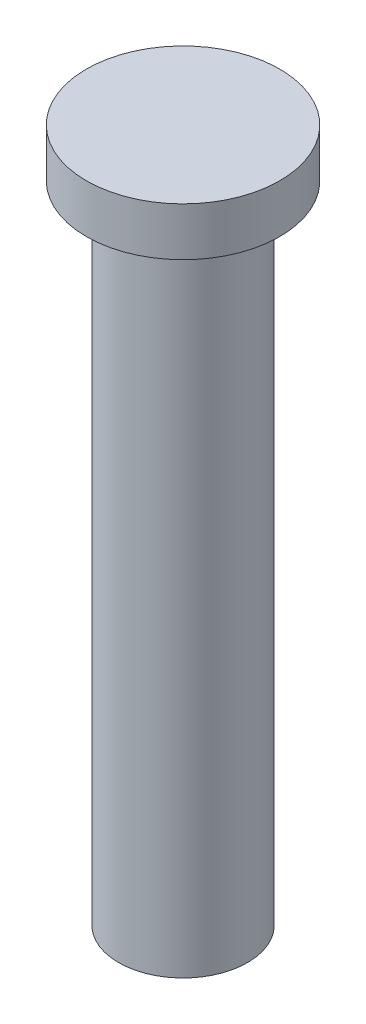
ISO-10303-21;
HEADER;
FILE_DESCRIPTION(('STEP AP214'),'2;1');
FILE_NAME('part.step','',(''),(''),'','','');
FILE_SCHEMA(('AUTOMOTIVE_DESIGN { 1 0 10303 214 1 1 1 1 }'));
ENDSEC;
DATA;
#1=APPLICATION_CONTEXT('core data for automotive mechanical design processes');
#2=APPLICATION_PROTOCOL_DEFINITION('international standard','automotive_design',2000,#1);
#3=PRODUCT_CONTEXT('',#1,'mechanical');
#4=PRODUCT('Part','Part','',(#3));
#5=PRODUCT_RELATED_PRODUCT_CATEGORY('part','',(#4));
#6=PRODUCT_DEFINITION_FORMATION('','',#4);
#7=PRODUCT_DEFINITION_CONTEXT('part definition',#1,'design');
#8=PRODUCT_DEFINITION('design','',#6,#7);
#9=PRODUCT_DEFINITION_SHAPE('','',#8);
#10=(LENGTH_UNIT() NAMED_UNIT(*) SI_UNIT(.MILLI.,.METRE.));
#11=(NAMED_UNIT(*) PLANE_ANGLE_UNIT() SI_UNIT($,.RADIAN.));
#12=(NAMED_UNIT(*) SI_UNIT($,.STERADIAN.) SOLID_ANGLE_UNIT());
#13=UNCERTAINTY_MEASURE_WITH_UNIT(LENGTH_MEASURE(1.E-05),#10,'distance_accuracy_value','');
#14=(GEOMETRIC_REPRESENTATION_CONTEXT(3) GLOBAL_UNCERTAINTY_ASSIGNED_CONTEXT((#13)) GLOBAL_UNIT_ASSIGNED_CONTEXT((#10,
#11,#12)) REPRESENTATION_CONTEXT('',''));
#15=CARTESIAN_POINT('',(0.,0.,0.));
#16=DIRECTION('',(0.,0.,1.));
#17=DIRECTION('',(1.,0.,0.));
#18=AXIS2_PLACEMENT_3D('',#15,#16,#17);
#19=CARTESIAN_POINT('',(0.,20.,0.));
#20=DIRECTION('',(0.,-1.,0.));
#21=DIRECTION('',(0.,0.,-1.));
#22=AXIS2_PLACEMENT_3D('',#19,#20,#21);
#23=CYLINDRICAL_SURFACE('',#22,2.);
#24=CARTESIAN_POINT('',(0.,20.,0.));
#25=DIRECTION('',(0.,1.,0.));
#26=DIRECTION('',(0.,0.,1.));
#27=AXIS2_PLACEMENT_3D('',#24,#25,#26);
#28=CIRCLE('',#27,2.);
#29=CARTESIAN_POINT('',(0.,20.,2.));
#30=VERTEX_POINT('',#29);
#31=EDGE_CURVE('E10',#30,#30,#28,.T.);
#32=ORIENTED_EDGE('',*,*,#31,.F.);
#33=EDGE_LOOP('',(#32));
#34=FACE_BOUND('',#33,.T.);
#35=CARTESIAN_POINT('',(0.,0.,0.));
#36=DIRECTION('',(0.,1.,0.));
#37=DIRECTION('',(0.,0.,1.));
#38=AXIS2_PLACEMENT_3D('',#35,#36,#37);
#39=CIRCLE('',#38,2.);
#40=CARTESIAN_POINT('',(0.,0.,2.));
#41=VERTEX_POINT('',#40);
#42=EDGE_CURVE('E36',#41,#41,#39,.T.);
#43=ORIENTED_EDGE('',*,*,#42,.T.);
#44=EDGE_LOOP('',(#43));
#45=FACE_BOUND('',#44,.T.);
#46=ADVANCED_FACE('F33',(#34,#45),#23,.T.);
#47=CARTESIAN_POINT('',(0.,0.,0.));
#48=DIRECTION('',(0.,1.,0.));
#49=DIRECTION('',(0.,0.,1.));
#50=AXIS2_PLACEMENT_3D('',#47,#48,#49);
#51=PLANE('',#50);
#52=ORIENTED_EDGE('',*,*,#42,.F.);
#53=EDGE_LOOP('',(#52));
#54=FACE_BOUND('',#53,.T.);
#55=ADVANCED_FACE('F56',(#54),#51,.F.);
#56=CARTESIAN_POINT('',(0.,21.5,0.));
#57=DIRECTION('',(0.,-1.,0.));
#58=DIRECTION('',(0.,0.,-1.));
#59=AXIS2_PLACEMENT_3D('',#56,#57,#58);
#60=CYLINDRICAL_SURFACE('',#59,3.);
#61=CARTESIAN_POINT('',(0.,21.5,0.));
#62=DIRECTION('',(0.,1.,0.));
#63=DIRECTION('',(0.,0.,1.));
#64=AXIS2_PLACEMENT_3D('',#61,#62,#63);
#65=CIRCLE('',#64,3.);
#66=CARTESIAN_POINT('',(0.,21.5,3.));
#67=VERTEX_POINT('',#66);
#68=EDGE_CURVE('E43',#67,#67,#65,.T.);
#69=ORIENTED_EDGE('',*,*,#68,.F.);
#70=EDGE_LOOP('',(#69));
#71=FACE_BOUND('',#70,.T.);
#72=CARTESIAN_POINT('',(0.,20.,0.));
#73=DIRECTION('',(0.,1.,0.));
#74=DIRECTION('',(0.,0.,1.));
#75=AXIS2_PLACEMENT_3D('',#72,#73,#74);
#76=CIRCLE('',#75,3.);
#77=CARTESIAN_POINT('',(0.,20.,3.));
#78=VERTEX_POINT('',#77);
#79=EDGE_CURVE('E45',#78,#78,#76,.T.);
#80=ORIENTED_EDGE('',*,*,#79,.T.);
#81=EDGE_LOOP('',(#80));
#82=FACE_BOUND('',#81,.T.);
#83=ADVANCED_FACE('F53',(#71,#82),#60,.T.);
#84=CARTESIAN_POINT('',(0.,21.5,0.));
#85=DIRECTION('',(0.,1.,0.));
#86=DIRECTION('',(0.,0.,1.));
#87=AXIS2_PLACEMENT_3D('',#84,#85,#86);
#88=PLANE('',#87);
#89=ORIENTED_EDGE('',*,*,#68,.T.);
#90=EDGE_LOOP('',(#89));
#91=FACE_BOUND('',#90,.T.);
#92=ADVANCED_FACE('F51',(#91),#88,.T.);
#93=CARTESIAN_POINT('',(0.,20.,0.));
#94=DIRECTION('',(0.,1.,0.));
#95=DIRECTION('',(0.,0.,1.));
#96=AXIS2_PLACEMENT_3D('',#93,#94,#95);
#97=PLANE('',#96);
#98=ORIENTED_EDGE('',*,*,#31,.T.);
#99=EDGE_LOOP('',(#98));
#100=FACE_BOUND('',#99,.T.);
#101=ORIENTED_EDGE('',*,*,#79,.F.);
#102=EDGE_LOOP('',(#101));
#103=FACE_BOUND('',#102,.T.);
#104=ADVANCED_FACE('F60',(#100,#103),#97,.F.);
#105=CLOSED_SHELL('',(#46,#55,#83,#92,#104));
#106=MANIFOLD_SOLID_BREP('B2',#105);
#107=ADVANCED_BREP_SHAPE_REPRESENTATION('',(#18,#106),#14);
#108=SHAPE_DEFINITION_REPRESENTATION(#9,#107);
ENDSEC;
END-ISO-10303-21;
